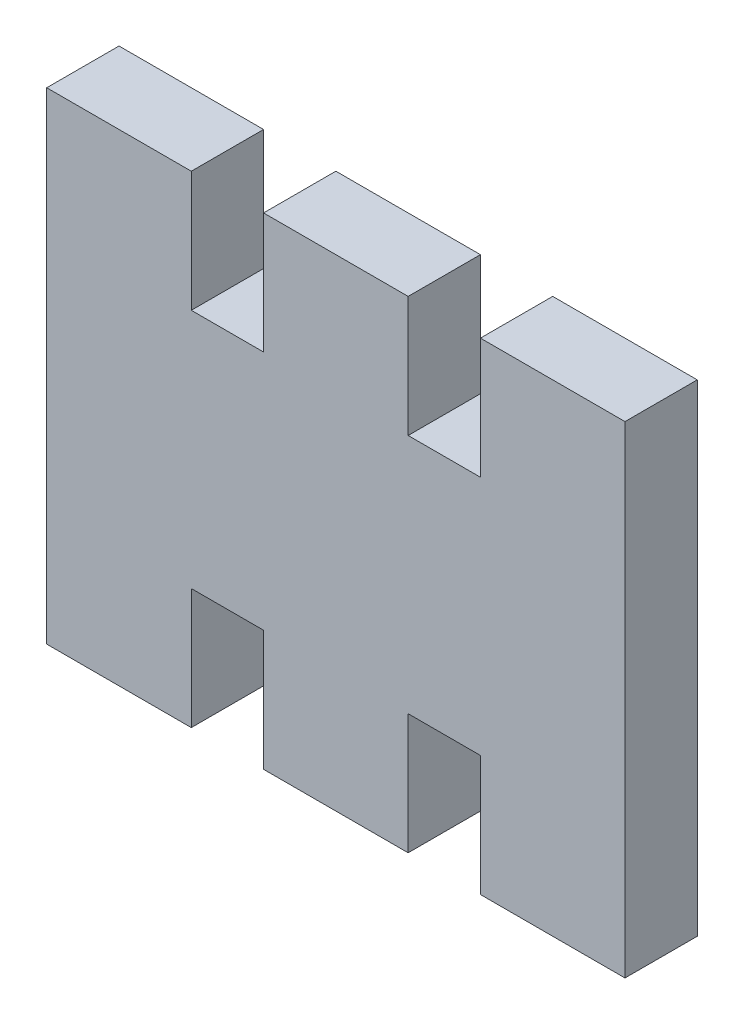
ISO-10303-21;
HEADER;
FILE_DESCRIPTION(('STEP AP214'),'2;1');
FILE_NAME('part.step','',(''),(''),'','','');
FILE_SCHEMA(('AUTOMOTIVE_DESIGN { 1 0 10303 214 1 1 1 1 }'));
ENDSEC;
DATA;
#1=APPLICATION_CONTEXT('core data for automotive mechanical design processes');
#2=APPLICATION_PROTOCOL_DEFINITION('international standard','automotive_design',2000,#1);
#3=PRODUCT_CONTEXT('',#1,'mechanical');
#4=PRODUCT('Part','Part','',(#3));
#5=PRODUCT_RELATED_PRODUCT_CATEGORY('part','',(#4));
#6=PRODUCT_DEFINITION_FORMATION('','',#4);
#7=PRODUCT_DEFINITION_CONTEXT('part definition',#1,'design');
#8=PRODUCT_DEFINITION('design','',#6,#7);
#9=PRODUCT_DEFINITION_SHAPE('','',#8);
#10=(LENGTH_UNIT() NAMED_UNIT(*) SI_UNIT(.MILLI.,.METRE.));
#11=(NAMED_UNIT(*) PLANE_ANGLE_UNIT() SI_UNIT($,.RADIAN.));
#12=(NAMED_UNIT(*) SI_UNIT($,.STERADIAN.) SOLID_ANGLE_UNIT());
#13=UNCERTAINTY_MEASURE_WITH_UNIT(LENGTH_MEASURE(1.E-05),#10,'distance_accuracy_value','');
#14=(GEOMETRIC_REPRESENTATION_CONTEXT(3) GLOBAL_UNCERTAINTY_ASSIGNED_CONTEXT((#13)) GLOBAL_UNIT_ASSIGNED_CONTEXT((#10,
#11,#12)) REPRESENTATION_CONTEXT('',''));
#15=CARTESIAN_POINT('',(0.,0.,0.));
#16=DIRECTION('',(0.,0.,1.));
#17=DIRECTION('',(1.,0.,0.));
#18=AXIS2_PLACEMENT_3D('',#15,#16,#17);
#19=CARTESIAN_POINT('',(0.,40.,6.));
#20=DIRECTION('',(0.,-1.,0.));
#21=DIRECTION('',(1.,0.,0.));
#22=AXIS2_PLACEMENT_3D('',#19,#20,#21);
#23=PLANE('',#22);
#24=DIRECTION('',(-1.,0.,0.));
#25=VECTOR('',#24,1.);
#26=CARTESIAN_POINT('',(0.,40.,6.));
#27=LINE('',#26,#25);
#28=CARTESIAN_POINT('',(-18.,40.,6.));
#29=VERTEX_POINT('',#28);
#30=CARTESIAN_POINT('',(-30.,40.,6.));
#31=VERTEX_POINT('',#30);
#32=EDGE_CURVE('E257',#29,#31,#27,.T.);
#33=ORIENTED_EDGE('',*,*,#32,.F.);
#34=DIRECTION('',(0.,0.,1.));
#35=VECTOR('',#34,1.);
#36=CARTESIAN_POINT('',(-18.,40.,0.));
#37=LINE('',#36,#35);
#38=CARTESIAN_POINT('',(-18.,40.,0.));
#39=VERTEX_POINT('',#38);
#40=EDGE_CURVE('E343',#39,#29,#37,.T.);
#41=ORIENTED_EDGE('',*,*,#40,.F.);
#42=DIRECTION('',(-1.,0.,0.));
#43=VECTOR('',#42,1.);
#44=CARTESIAN_POINT('',(0.,40.,0.));
#45=LINE('',#44,#43);
#46=CARTESIAN_POINT('',(-30.,40.,0.));
#47=VERTEX_POINT('',#46);
#48=EDGE_CURVE('E236',#39,#47,#45,.T.);
#49=ORIENTED_EDGE('',*,*,#48,.T.);
#50=DIRECTION('',(0.,0.,1.));
#51=VECTOR('',#50,1.);
#52=CARTESIAN_POINT('',(-30.,40.,0.));
#53=LINE('',#52,#51);
#54=EDGE_CURVE('E266',#47,#31,#53,.T.);
#55=ORIENTED_EDGE('',*,*,#54,.T.);
#56=EDGE_LOOP('',(#33,#41,#49,#55));
#57=FACE_BOUND('',#56,.T.);
#58=ADVANCED_FACE('F45',(#57),#23,.F.);
#59=CARTESIAN_POINT('',(0.,0.,6.));
#60=DIRECTION('',(0.,1.,0.));
#61=DIRECTION('',(-1.,0.,0.));
#62=AXIS2_PLACEMENT_3D('',#59,#60,#61);
#63=PLANE('',#62);
#64=DIRECTION('',(1.,0.,0.));
#65=VECTOR('',#64,1.);
#66=CARTESIAN_POINT('',(0.,0.,0.));
#67=LINE('',#66,#65);
#68=CARTESIAN_POINT('',(-48.,0.,0.));
#69=VERTEX_POINT('',#68);
#70=CARTESIAN_POINT('',(-36.,0.,0.));
#71=VERTEX_POINT('',#70);
#72=EDGE_CURVE('E200',#69,#71,#67,.T.);
#73=ORIENTED_EDGE('',*,*,#72,.T.);
#74=DIRECTION('',(0.,0.,1.));
#75=VECTOR('',#74,1.);
#76=CARTESIAN_POINT('',(-36.,0.,0.));
#77=LINE('',#76,#75);
#78=CARTESIAN_POINT('',(-36.,0.,6.));
#79=VERTEX_POINT('',#78);
#80=EDGE_CURVE('E183',#71,#79,#77,.T.);
#81=ORIENTED_EDGE('',*,*,#80,.T.);
#82=DIRECTION('',(1.,0.,0.));
#83=VECTOR('',#82,1.);
#84=CARTESIAN_POINT('',(0.,0.,6.));
#85=LINE('',#84,#83);
#86=CARTESIAN_POINT('',(-48.,0.,6.));
#87=VERTEX_POINT('',#86);
#88=EDGE_CURVE('E245',#87,#79,#85,.T.);
#89=ORIENTED_EDGE('',*,*,#88,.F.);
#90=DIRECTION('',(0.,0.,-1.));
#91=VECTOR('',#90,1.);
#92=CARTESIAN_POINT('',(-48.,0.,6.));
#93=LINE('',#92,#91);
#94=EDGE_CURVE('E209',#87,#69,#93,.T.);
#95=ORIENTED_EDGE('',*,*,#94,.T.);
#96=EDGE_LOOP('',(#73,#81,#89,#95));
#97=FACE_BOUND('',#96,.T.);
#98=ADVANCED_FACE('F207',(#97),#63,.F.);
#99=CARTESIAN_POINT('',(-30.,0.,6.));
#100=VERTEX_POINT('',#99);
#101=CARTESIAN_POINT('',(-18.,0.,6.));
#102=VERTEX_POINT('',#101);
#103=EDGE_CURVE('E249',#100,#102,#85,.T.);
#104=ORIENTED_EDGE('',*,*,#103,.F.);
#105=DIRECTION('',(0.,0.,1.));
#106=VECTOR('',#105,1.);
#107=CARTESIAN_POINT('',(-30.,0.,0.));
#108=LINE('',#107,#106);
#109=CARTESIAN_POINT('',(-30.,0.,0.));
#110=VERTEX_POINT('',#109);
#111=EDGE_CURVE('E194',#110,#100,#108,.T.);
#112=ORIENTED_EDGE('',*,*,#111,.F.);
#113=CARTESIAN_POINT('',(-18.,0.,0.));
#114=VERTEX_POINT('',#113);
#115=EDGE_CURVE('E212',#110,#114,#67,.T.);
#116=ORIENTED_EDGE('',*,*,#115,.T.);
#117=DIRECTION('',(0.,0.,1.));
#118=VECTOR('',#117,1.);
#119=CARTESIAN_POINT('',(-18.,0.,0.));
#120=LINE('',#119,#118);
#121=EDGE_CURVE('E296',#114,#102,#120,.T.);
#122=ORIENTED_EDGE('',*,*,#121,.T.);
#123=EDGE_LOOP('',(#104,#112,#116,#122));
#124=FACE_BOUND('',#123,.T.);
#125=ADVANCED_FACE('F392',(#124),#63,.F.);
#126=CARTESIAN_POINT('',(-36.,40.,6.));
#127=VERTEX_POINT('',#126);
#128=CARTESIAN_POINT('',(-48.,40.,6.));
#129=VERTEX_POINT('',#128);
#130=EDGE_CURVE('E218',#127,#129,#27,.T.);
#131=ORIENTED_EDGE('',*,*,#130,.F.);
#132=DIRECTION('',(0.,0.,1.));
#133=VECTOR('',#132,1.);
#134=CARTESIAN_POINT('',(-36.,40.,0.));
#135=LINE('',#134,#133);
#136=CARTESIAN_POINT('',(-36.,40.,0.));
#137=VERTEX_POINT('',#136);
#138=EDGE_CURVE('E244',#137,#127,#135,.T.);
#139=ORIENTED_EDGE('',*,*,#138,.F.);
#140=CARTESIAN_POINT('',(-48.,40.,0.));
#141=VERTEX_POINT('',#140);
#142=EDGE_CURVE('E238',#137,#141,#45,.T.);
#143=ORIENTED_EDGE('',*,*,#142,.T.);
#144=DIRECTION('',(0.,0.,-1.));
#145=VECTOR('',#144,1.);
#146=CARTESIAN_POINT('',(-48.,40.,6.));
#147=LINE('',#146,#145);
#148=EDGE_CURVE('E54',#129,#141,#147,.T.);
#149=ORIENTED_EDGE('',*,*,#148,.F.);
#150=EDGE_LOOP('',(#131,#139,#143,#149));
#151=FACE_BOUND('',#150,.T.);
#152=ADVANCED_FACE('F434',(#151),#23,.F.);
#153=CARTESIAN_POINT('',(0.,0.,6.));
#154=DIRECTION('',(-1.,0.,0.));
#155=DIRECTION('',(0.,0.,1.));
#156=AXIS2_PLACEMENT_3D('',#153,#154,#155);
#157=PLANE('',#156);
#158=DIRECTION('',(0.,1.,0.));
#159=VECTOR('',#158,1.);
#160=CARTESIAN_POINT('',(0.,0.,0.));
#161=LINE('',#160,#159);
#162=CARTESIAN_POINT('',(0.,0.,0.));
#163=VERTEX_POINT('',#162);
#164=CARTESIAN_POINT('',(0.,40.,0.));
#165=VERTEX_POINT('',#164);
#166=EDGE_CURVE('E240',#163,#165,#161,.T.);
#167=ORIENTED_EDGE('',*,*,#166,.T.);
#168=DIRECTION('',(0.,0.,-1.));
#169=VECTOR('',#168,1.);
#170=CARTESIAN_POINT('',(0.,40.,6.));
#171=LINE('',#170,#169);
#172=CARTESIAN_POINT('',(0.,40.,6.));
#173=VERTEX_POINT('',#172);
#174=EDGE_CURVE('E11',#173,#165,#171,.T.);
#175=ORIENTED_EDGE('',*,*,#174,.F.);
#176=DIRECTION('',(0.,1.,0.));
#177=VECTOR('',#176,1.);
#178=CARTESIAN_POINT('',(0.,0.,6.));
#179=LINE('',#178,#177);
#180=CARTESIAN_POINT('',(0.,0.,6.));
#181=VERTEX_POINT('',#180);
#182=EDGE_CURVE('E211',#181,#173,#179,.T.);
#183=ORIENTED_EDGE('',*,*,#182,.F.);
#184=DIRECTION('',(0.,0.,-1.));
#185=VECTOR('',#184,1.);
#186=CARTESIAN_POINT('',(0.,0.,6.));
#187=LINE('',#186,#185);
#188=EDGE_CURVE('E248',#181,#163,#187,.T.);
#189=ORIENTED_EDGE('',*,*,#188,.T.);
#190=EDGE_LOOP('',(#167,#175,#183,#189));
#191=FACE_BOUND('',#190,.T.);
#192=ADVANCED_FACE('F47',(#191),#157,.F.);
#193=CARTESIAN_POINT('',(-12.,40.,0.));
#194=VERTEX_POINT('',#193);
#195=EDGE_CURVE('E231',#165,#194,#45,.T.);
#196=ORIENTED_EDGE('',*,*,#195,.T.);
#197=DIRECTION('',(0.,0.,1.));
#198=VECTOR('',#197,1.);
#199=CARTESIAN_POINT('',(-12.,40.,0.));
#200=LINE('',#199,#198);
#201=CARTESIAN_POINT('',(-12.,40.,6.));
#202=VERTEX_POINT('',#201);
#203=EDGE_CURVE('E339',#194,#202,#200,.T.);
#204=ORIENTED_EDGE('',*,*,#203,.T.);
#205=EDGE_CURVE('E254',#173,#202,#27,.T.);
#206=ORIENTED_EDGE('',*,*,#205,.F.);
#207=ORIENTED_EDGE('',*,*,#174,.T.);
#208=EDGE_LOOP('',(#196,#204,#206,#207));
#209=FACE_BOUND('',#208,.T.);
#210=ADVANCED_FACE('F409',(#209),#23,.F.);
#211=CARTESIAN_POINT('',(-48.,0.,6.));
#212=DIRECTION('',(1.,0.,0.));
#213=DIRECTION('',(0.,0.,-1.));
#214=AXIS2_PLACEMENT_3D('',#211,#212,#213);
#215=PLANE('',#214);
#216=DIRECTION('',(0.,-1.,0.));
#217=VECTOR('',#216,1.);
#218=CARTESIAN_POINT('',(-48.,0.,0.));
#219=LINE('',#218,#217);
#220=EDGE_CURVE('E224',#141,#69,#219,.T.);
#221=ORIENTED_EDGE('',*,*,#220,.T.);
#222=ORIENTED_EDGE('',*,*,#94,.F.);
#223=DIRECTION('',(0.,-1.,0.));
#224=VECTOR('',#223,1.);
#225=CARTESIAN_POINT('',(-48.,0.,6.));
#226=LINE('',#225,#224);
#227=EDGE_CURVE('E251',#129,#87,#226,.T.);
#228=ORIENTED_EDGE('',*,*,#227,.F.);
#229=ORIENTED_EDGE('',*,*,#148,.T.);
#230=EDGE_LOOP('',(#221,#222,#228,#229));
#231=FACE_BOUND('',#230,.T.);
#232=ADVANCED_FACE('F437',(#231),#215,.F.);
#233=CARTESIAN_POINT('',(-12.,0.,6.));
#234=VERTEX_POINT('',#233);
#235=EDGE_CURVE('E250',#234,#181,#85,.T.);
#236=ORIENTED_EDGE('',*,*,#235,.F.);
#237=DIRECTION('',(0.,0.,1.));
#238=VECTOR('',#237,1.);
#239=CARTESIAN_POINT('',(-12.,0.,0.));
#240=LINE('',#239,#238);
#241=CARTESIAN_POINT('',(-12.,0.,0.));
#242=VERTEX_POINT('',#241);
#243=EDGE_CURVE('E300',#242,#234,#240,.T.);
#244=ORIENTED_EDGE('',*,*,#243,.F.);
#245=EDGE_CURVE('E214',#242,#163,#67,.T.);
#246=ORIENTED_EDGE('',*,*,#245,.T.);
#247=ORIENTED_EDGE('',*,*,#188,.F.);
#248=EDGE_LOOP('',(#236,#244,#246,#247));
#249=FACE_BOUND('',#248,.T.);
#250=ADVANCED_FACE('F404',(#249),#63,.F.);
#251=CARTESIAN_POINT('',(0.,0.,6.));
#252=DIRECTION('',(0.,0.,1.));
#253=DIRECTION('',(1.,0.,0.));
#254=AXIS2_PLACEMENT_3D('',#251,#252,#253);
#255=PLANE('',#254);
#256=DIRECTION('',(0.,-1.,0.));
#257=VECTOR('',#256,1.);
#258=CARTESIAN_POINT('',(-36.,10.,6.));
#259=LINE('',#258,#257);
#260=CARTESIAN_POINT('',(-36.,10.,6.));
#261=VERTEX_POINT('',#260);
#262=EDGE_CURVE('E188',#261,#79,#259,.T.);
#263=ORIENTED_EDGE('',*,*,#262,.F.);
#264=DIRECTION('',(-1.,0.,0.));
#265=VECTOR('',#264,1.);
#266=CARTESIAN_POINT('',(-36.,10.,6.));
#267=LINE('',#266,#265);
#268=CARTESIAN_POINT('',(-30.,10.,6.));
#269=VERTEX_POINT('',#268);
#270=EDGE_CURVE('E204',#269,#261,#267,.T.);
#271=ORIENTED_EDGE('',*,*,#270,.F.);
#272=DIRECTION('',(0.,1.,0.));
#273=VECTOR('',#272,1.);
#274=CARTESIAN_POINT('',(-30.,10.,6.));
#275=LINE('',#274,#273);
#276=EDGE_CURVE('E376',#100,#269,#275,.T.);
#277=ORIENTED_EDGE('',*,*,#276,.F.);
#278=ORIENTED_EDGE('',*,*,#103,.T.);
#279=DIRECTION('',(0.,-1.,0.));
#280=VECTOR('',#279,1.);
#281=CARTESIAN_POINT('',(-18.,10.,6.));
#282=LINE('',#281,#280);
#283=CARTESIAN_POINT('',(-18.,10.,6.));
#284=VERTEX_POINT('',#283);
#285=EDGE_CURVE('E320',#284,#102,#282,.T.);
#286=ORIENTED_EDGE('',*,*,#285,.F.);
#287=DIRECTION('',(-1.,0.,0.));
#288=VECTOR('',#287,1.);
#289=CARTESIAN_POINT('',(-18.,10.,6.));
#290=LINE('',#289,#288);
#291=CARTESIAN_POINT('',(-12.,10.,6.));
#292=VERTEX_POINT('',#291);
#293=EDGE_CURVE('E311',#292,#284,#290,.T.);
#294=ORIENTED_EDGE('',*,*,#293,.F.);
#295=DIRECTION('',(0.,1.,0.));
#296=VECTOR('',#295,1.);
#297=CARTESIAN_POINT('',(-12.,10.,6.));
#298=LINE('',#297,#296);
#299=EDGE_CURVE('E316',#234,#292,#298,.T.);
#300=ORIENTED_EDGE('',*,*,#299,.F.);
#301=ORIENTED_EDGE('',*,*,#235,.T.);
#302=ORIENTED_EDGE('',*,*,#182,.T.);
#303=ORIENTED_EDGE('',*,*,#205,.T.);
#304=DIRECTION('',(0.,1.,0.));
#305=VECTOR('',#304,1.);
#306=CARTESIAN_POINT('',(-12.,40.,6.));
#307=LINE('',#306,#305);
#308=CARTESIAN_POINT('',(-12.,30.,6.));
#309=VERTEX_POINT('',#308);
#310=EDGE_CURVE('E346',#309,#202,#307,.T.);
#311=ORIENTED_EDGE('',*,*,#310,.F.);
#312=DIRECTION('',(1.,0.,0.));
#313=VECTOR('',#312,1.);
#314=CARTESIAN_POINT('',(-18.,30.,6.));
#315=LINE('',#314,#313);
#316=CARTESIAN_POINT('',(-18.,30.,6.));
#317=VERTEX_POINT('',#316);
#318=EDGE_CURVE('E350',#317,#309,#315,.T.);
#319=ORIENTED_EDGE('',*,*,#318,.F.);
#320=DIRECTION('',(0.,-1.,0.));
#321=VECTOR('',#320,1.);
#322=CARTESIAN_POINT('',(-18.,40.,6.));
#323=LINE('',#322,#321);
#324=EDGE_CURVE('E310',#29,#317,#323,.T.);
#325=ORIENTED_EDGE('',*,*,#324,.F.);
#326=ORIENTED_EDGE('',*,*,#32,.T.);
#327=DIRECTION('',(0.,1.,0.));
#328=VECTOR('',#327,1.);
#329=CARTESIAN_POINT('',(-30.,40.,6.));
#330=LINE('',#329,#328);
#331=CARTESIAN_POINT('',(-30.,30.,6.));
#332=VERTEX_POINT('',#331);
#333=EDGE_CURVE('E272',#332,#31,#330,.T.);
#334=ORIENTED_EDGE('',*,*,#333,.F.);
#335=DIRECTION('',(1.,0.,0.));
#336=VECTOR('',#335,1.);
#337=CARTESIAN_POINT('',(-36.,30.,6.));
#338=LINE('',#337,#336);
#339=CARTESIAN_POINT('',(-36.,30.,6.));
#340=VERTEX_POINT('',#339);
#341=EDGE_CURVE('E277',#340,#332,#338,.T.);
#342=ORIENTED_EDGE('',*,*,#341,.F.);
#343=DIRECTION('',(0.,-1.,0.));
#344=VECTOR('',#343,1.);
#345=CARTESIAN_POINT('',(-36.,40.,6.));
#346=LINE('',#345,#344);
#347=EDGE_CURVE('E281',#127,#340,#346,.T.);
#348=ORIENTED_EDGE('',*,*,#347,.F.);
#349=ORIENTED_EDGE('',*,*,#130,.T.);
#350=ORIENTED_EDGE('',*,*,#227,.T.);
#351=ORIENTED_EDGE('',*,*,#88,.T.);
#352=EDGE_LOOP('',(#263,#271,#277,#278,#286,#294,#300,#301,#302,#303,#311,#319,#325,#326,#334,
#342,#348,#349,#350,#351));
#353=FACE_BOUND('',#352,.T.);
#354=ADVANCED_FACE('F400',(#353),#255,.T.);
#355=CARTESIAN_POINT('',(0.,0.,0.));
#356=DIRECTION('',(0.,0.,1.));
#357=DIRECTION('',(1.,0.,0.));
#358=AXIS2_PLACEMENT_3D('',#355,#356,#357);
#359=PLANE('',#358);
#360=DIRECTION('',(-1.,0.,0.));
#361=VECTOR('',#360,1.);
#362=CARTESIAN_POINT('',(-36.,10.,0.));
#363=LINE('',#362,#361);
#364=CARTESIAN_POINT('',(-30.,10.,0.));
#365=VERTEX_POINT('',#364);
#366=CARTESIAN_POINT('',(-36.,10.,0.));
#367=VERTEX_POINT('',#366);
#368=EDGE_CURVE('E61',#365,#367,#363,.T.);
#369=ORIENTED_EDGE('',*,*,#368,.T.);
#370=DIRECTION('',(0.,-1.,0.));
#371=VECTOR('',#370,1.);
#372=CARTESIAN_POINT('',(-36.,10.,0.));
#373=LINE('',#372,#371);
#374=EDGE_CURVE('E186',#367,#71,#373,.T.);
#375=ORIENTED_EDGE('',*,*,#374,.T.);
#376=ORIENTED_EDGE('',*,*,#72,.F.);
#377=ORIENTED_EDGE('',*,*,#220,.F.);
#378=ORIENTED_EDGE('',*,*,#142,.F.);
#379=DIRECTION('',(0.,-1.,0.));
#380=VECTOR('',#379,1.);
#381=CARTESIAN_POINT('',(-36.,40.,0.));
#382=LINE('',#381,#380);
#383=CARTESIAN_POINT('',(-36.,30.,0.));
#384=VERTEX_POINT('',#383);
#385=EDGE_CURVE('E276',#137,#384,#382,.T.);
#386=ORIENTED_EDGE('',*,*,#385,.T.);
#387=DIRECTION('',(1.,0.,0.));
#388=VECTOR('',#387,1.);
#389=CARTESIAN_POINT('',(-36.,30.,0.));
#390=LINE('',#389,#388);
#391=CARTESIAN_POINT('',(-30.,30.,0.));
#392=VERTEX_POINT('',#391);
#393=EDGE_CURVE('E289',#384,#392,#390,.T.);
#394=ORIENTED_EDGE('',*,*,#393,.T.);
#395=DIRECTION('',(0.,1.,0.));
#396=VECTOR('',#395,1.);
#397=CARTESIAN_POINT('',(-30.,40.,0.));
#398=LINE('',#397,#396);
#399=EDGE_CURVE('E263',#392,#47,#398,.T.);
#400=ORIENTED_EDGE('',*,*,#399,.T.);
#401=ORIENTED_EDGE('',*,*,#48,.F.);
#402=DIRECTION('',(0.,-1.,0.));
#403=VECTOR('',#402,1.);
#404=CARTESIAN_POINT('',(-18.,40.,0.));
#405=LINE('',#404,#403);
#406=CARTESIAN_POINT('',(-18.,30.,0.));
#407=VERTEX_POINT('',#406);
#408=EDGE_CURVE('E349',#39,#407,#405,.T.);
#409=ORIENTED_EDGE('',*,*,#408,.T.);
#410=DIRECTION('',(1.,0.,0.));
#411=VECTOR('',#410,1.);
#412=CARTESIAN_POINT('',(-18.,30.,0.));
#413=LINE('',#412,#411);
#414=CARTESIAN_POINT('',(-12.,30.,0.));
#415=VERTEX_POINT('',#414);
#416=EDGE_CURVE('E359',#407,#415,#413,.T.);
#417=ORIENTED_EDGE('',*,*,#416,.T.);
#418=DIRECTION('',(0.,1.,0.));
#419=VECTOR('',#418,1.);
#420=CARTESIAN_POINT('',(-12.,40.,0.));
#421=LINE('',#420,#419);
#422=EDGE_CURVE('E69',#415,#194,#421,.T.);
#423=ORIENTED_EDGE('',*,*,#422,.T.);
#424=ORIENTED_EDGE('',*,*,#195,.F.);
#425=ORIENTED_EDGE('',*,*,#166,.F.);
#426=ORIENTED_EDGE('',*,*,#245,.F.);
#427=DIRECTION('',(0.,1.,0.));
#428=VECTOR('',#427,1.);
#429=CARTESIAN_POINT('',(-12.,10.,0.));
#430=LINE('',#429,#428);
#431=CARTESIAN_POINT('',(-12.,10.,0.));
#432=VERTEX_POINT('',#431);
#433=EDGE_CURVE('E326',#242,#432,#430,.T.);
#434=ORIENTED_EDGE('',*,*,#433,.T.);
#435=DIRECTION('',(-1.,0.,0.));
#436=VECTOR('',#435,1.);
#437=CARTESIAN_POINT('',(-18.,10.,0.));
#438=LINE('',#437,#436);
#439=CARTESIAN_POINT('',(-18.,10.,0.));
#440=VERTEX_POINT('',#439);
#441=EDGE_CURVE('E301',#432,#440,#438,.T.);
#442=ORIENTED_EDGE('',*,*,#441,.T.);
#443=DIRECTION('',(0.,-1.,0.));
#444=VECTOR('',#443,1.);
#445=CARTESIAN_POINT('',(-18.,10.,0.));
#446=LINE('',#445,#444);
#447=EDGE_CURVE('E315',#440,#114,#446,.T.);
#448=ORIENTED_EDGE('',*,*,#447,.T.);
#449=ORIENTED_EDGE('',*,*,#115,.F.);
#450=DIRECTION('',(0.,1.,0.));
#451=VECTOR('',#450,1.);
#452=CARTESIAN_POINT('',(-30.,10.,0.));
#453=LINE('',#452,#451);
#454=EDGE_CURVE('E203',#110,#365,#453,.T.);
#455=ORIENTED_EDGE('',*,*,#454,.T.);
#456=EDGE_LOOP('',(#369,#375,#376,#377,#378,#386,#394,#400,#401,#409,#417,#423,#424,#425,#426,
#434,#442,#448,#449,#455));
#457=FACE_BOUND('',#456,.T.);
#458=ADVANCED_FACE('F198',(#457),#359,.F.);
#459=CARTESIAN_POINT('',(-36.,40.,0.));
#460=DIRECTION('',(-1.,0.,0.));
#461=DIRECTION('',(0.,0.,1.));
#462=AXIS2_PLACEMENT_3D('',#459,#460,#461);
#463=PLANE('',#462);
#464=ORIENTED_EDGE('',*,*,#347,.T.);
#465=DIRECTION('',(0.,0.,1.));
#466=VECTOR('',#465,1.);
#467=CARTESIAN_POINT('',(-36.,30.,0.));
#468=LINE('',#467,#466);
#469=EDGE_CURVE('E259',#384,#340,#468,.T.);
#470=ORIENTED_EDGE('',*,*,#469,.F.);
#471=ORIENTED_EDGE('',*,*,#385,.F.);
#472=ORIENTED_EDGE('',*,*,#138,.T.);
#473=EDGE_LOOP('',(#464,#470,#471,#472));
#474=FACE_BOUND('',#473,.T.);
#475=ADVANCED_FACE('F508',(#474),#463,.F.);
#476=CARTESIAN_POINT('',(-30.,40.,0.));
#477=DIRECTION('',(1.,0.,0.));
#478=DIRECTION('',(0.,0.,-1.));
#479=AXIS2_PLACEMENT_3D('',#476,#477,#478);
#480=PLANE('',#479);
#481=ORIENTED_EDGE('',*,*,#333,.T.);
#482=ORIENTED_EDGE('',*,*,#54,.F.);
#483=ORIENTED_EDGE('',*,*,#399,.F.);
#484=DIRECTION('',(0.,0.,1.));
#485=VECTOR('',#484,1.);
#486=CARTESIAN_POINT('',(-30.,30.,0.));
#487=LINE('',#486,#485);
#488=EDGE_CURVE('E262',#392,#332,#487,.T.);
#489=ORIENTED_EDGE('',*,*,#488,.T.);
#490=EDGE_LOOP('',(#481,#482,#483,#489));
#491=FACE_BOUND('',#490,.T.);
#492=ADVANCED_FACE('F497',(#491),#480,.F.);
#493=CARTESIAN_POINT('',(-36.,30.,0.));
#494=DIRECTION('',(0.,-1.,0.));
#495=DIRECTION('',(0.,0.,-1.));
#496=AXIS2_PLACEMENT_3D('',#493,#494,#495);
#497=PLANE('',#496);
#498=ORIENTED_EDGE('',*,*,#341,.T.);
#499=ORIENTED_EDGE('',*,*,#488,.F.);
#500=ORIENTED_EDGE('',*,*,#393,.F.);
#501=ORIENTED_EDGE('',*,*,#469,.T.);
#502=EDGE_LOOP('',(#498,#499,#500,#501));
#503=FACE_BOUND('',#502,.T.);
#504=ADVANCED_FACE('F491',(#503),#497,.F.);
#505=CARTESIAN_POINT('',(-18.,10.,0.));
#506=DIRECTION('',(-1.,0.,0.));
#507=DIRECTION('',(0.,0.,1.));
#508=AXIS2_PLACEMENT_3D('',#505,#506,#507);
#509=PLANE('',#508);
#510=ORIENTED_EDGE('',*,*,#285,.T.);
#511=ORIENTED_EDGE('',*,*,#121,.F.);
#512=ORIENTED_EDGE('',*,*,#447,.F.);
#513=DIRECTION('',(0.,0.,1.));
#514=VECTOR('',#513,1.);
#515=CARTESIAN_POINT('',(-18.,10.,0.));
#516=LINE('',#515,#514);
#517=EDGE_CURVE('E307',#440,#284,#516,.T.);
#518=ORIENTED_EDGE('',*,*,#517,.T.);
#519=EDGE_LOOP('',(#510,#511,#512,#518));
#520=FACE_BOUND('',#519,.T.);
#521=ADVANCED_FACE('F496',(#520),#509,.F.);
#522=CARTESIAN_POINT('',(-18.,10.,0.));
#523=DIRECTION('',(0.,1.,0.));
#524=DIRECTION('',(0.,0.,1.));
#525=AXIS2_PLACEMENT_3D('',#522,#523,#524);
#526=PLANE('',#525);
#527=ORIENTED_EDGE('',*,*,#293,.T.);
#528=ORIENTED_EDGE('',*,*,#517,.F.);
#529=ORIENTED_EDGE('',*,*,#441,.F.);
#530=DIRECTION('',(0.,0.,1.));
#531=VECTOR('',#530,1.);
#532=CARTESIAN_POINT('',(-12.,10.,0.));
#533=LINE('',#532,#531);
#534=EDGE_CURVE('E304',#432,#292,#533,.T.);
#535=ORIENTED_EDGE('',*,*,#534,.T.);
#536=EDGE_LOOP('',(#527,#528,#529,#535));
#537=FACE_BOUND('',#536,.T.);
#538=ADVANCED_FACE('F585',(#537),#526,.F.);
#539=CARTESIAN_POINT('',(-12.,10.,0.));
#540=DIRECTION('',(1.,0.,0.));
#541=DIRECTION('',(0.,0.,-1.));
#542=AXIS2_PLACEMENT_3D('',#539,#540,#541);
#543=PLANE('',#542);
#544=ORIENTED_EDGE('',*,*,#299,.T.);
#545=ORIENTED_EDGE('',*,*,#534,.F.);
#546=ORIENTED_EDGE('',*,*,#433,.F.);
#547=ORIENTED_EDGE('',*,*,#243,.T.);
#548=EDGE_LOOP('',(#544,#545,#546,#547));
#549=FACE_BOUND('',#548,.T.);
#550=ADVANCED_FACE('F587',(#549),#543,.F.);
#551=CARTESIAN_POINT('',(-18.,40.,0.));
#552=DIRECTION('',(-1.,0.,0.));
#553=DIRECTION('',(0.,0.,1.));
#554=AXIS2_PLACEMENT_3D('',#551,#552,#553);
#555=PLANE('',#554);
#556=ORIENTED_EDGE('',*,*,#324,.T.);
#557=DIRECTION('',(0.,0.,1.));
#558=VECTOR('',#557,1.);
#559=CARTESIAN_POINT('',(-18.,30.,0.));
#560=LINE('',#559,#558);
#561=EDGE_CURVE('E333',#407,#317,#560,.T.);
#562=ORIENTED_EDGE('',*,*,#561,.F.);
#563=ORIENTED_EDGE('',*,*,#408,.F.);
#564=ORIENTED_EDGE('',*,*,#40,.T.);
#565=EDGE_LOOP('',(#556,#562,#563,#564));
#566=FACE_BOUND('',#565,.T.);
#567=ADVANCED_FACE('F418',(#566),#555,.F.);
#568=CARTESIAN_POINT('',(-12.,40.,0.));
#569=DIRECTION('',(1.,0.,0.));
#570=DIRECTION('',(0.,0.,-1.));
#571=AXIS2_PLACEMENT_3D('',#568,#569,#570);
#572=PLANE('',#571);
#573=ORIENTED_EDGE('',*,*,#310,.T.);
#574=ORIENTED_EDGE('',*,*,#203,.F.);
#575=ORIENTED_EDGE('',*,*,#422,.F.);
#576=DIRECTION('',(0.,0.,1.));
#577=VECTOR('',#576,1.);
#578=CARTESIAN_POINT('',(-12.,30.,0.));
#579=LINE('',#578,#577);
#580=EDGE_CURVE('E336',#415,#309,#579,.T.);
#581=ORIENTED_EDGE('',*,*,#580,.T.);
#582=EDGE_LOOP('',(#573,#574,#575,#581));
#583=FACE_BOUND('',#582,.T.);
#584=ADVANCED_FACE('F413',(#583),#572,.F.);
#585=CARTESIAN_POINT('',(-18.,30.,0.));
#586=DIRECTION('',(0.,-1.,0.));
#587=DIRECTION('',(0.,0.,-1.));
#588=AXIS2_PLACEMENT_3D('',#585,#586,#587);
#589=PLANE('',#588);
#590=ORIENTED_EDGE('',*,*,#318,.T.);
#591=ORIENTED_EDGE('',*,*,#580,.F.);
#592=ORIENTED_EDGE('',*,*,#416,.F.);
#593=ORIENTED_EDGE('',*,*,#561,.T.);
#594=EDGE_LOOP('',(#590,#591,#592,#593));
#595=FACE_BOUND('',#594,.T.);
#596=ADVANCED_FACE('F416',(#595),#589,.F.);
#597=CARTESIAN_POINT('',(-36.,10.,0.));
#598=DIRECTION('',(-1.,0.,0.));
#599=DIRECTION('',(0.,0.,1.));
#600=AXIS2_PLACEMENT_3D('',#597,#598,#599);
#601=PLANE('',#600);
#602=ORIENTED_EDGE('',*,*,#262,.T.);
#603=ORIENTED_EDGE('',*,*,#80,.F.);
#604=ORIENTED_EDGE('',*,*,#374,.F.);
#605=DIRECTION('',(0.,0.,1.));
#606=VECTOR('',#605,1.);
#607=CARTESIAN_POINT('',(-36.,10.,0.));
#608=LINE('',#607,#606);
#609=EDGE_CURVE('E285',#367,#261,#608,.T.);
#610=ORIENTED_EDGE('',*,*,#609,.T.);
#611=EDGE_LOOP('',(#602,#603,#604,#610));
#612=FACE_BOUND('',#611,.T.);
#613=ADVANCED_FACE('F185',(#612),#601,.F.);
#614=CARTESIAN_POINT('',(-36.,10.,0.));
#615=DIRECTION('',(0.,1.,0.));
#616=DIRECTION('',(0.,0.,1.));
#617=AXIS2_PLACEMENT_3D('',#614,#615,#616);
#618=PLANE('',#617);
#619=ORIENTED_EDGE('',*,*,#270,.T.);
#620=ORIENTED_EDGE('',*,*,#609,.F.);
#621=ORIENTED_EDGE('',*,*,#368,.F.);
#622=DIRECTION('',(0.,0.,1.));
#623=VECTOR('',#622,1.);
#624=CARTESIAN_POINT('',(-30.,10.,0.));
#625=LINE('',#624,#623);
#626=EDGE_CURVE('E368',#365,#269,#625,.T.);
#627=ORIENTED_EDGE('',*,*,#626,.T.);
#628=EDGE_LOOP('',(#619,#620,#621,#627));
#629=FACE_BOUND('',#628,.T.);
#630=ADVANCED_FACE('F441',(#629),#618,.F.);
#631=CARTESIAN_POINT('',(-30.,10.,0.));
#632=DIRECTION('',(1.,0.,0.));
#633=DIRECTION('',(0.,0.,-1.));
#634=AXIS2_PLACEMENT_3D('',#631,#632,#633);
#635=PLANE('',#634);
#636=ORIENTED_EDGE('',*,*,#276,.T.);
#637=ORIENTED_EDGE('',*,*,#626,.F.);
#638=ORIENTED_EDGE('',*,*,#454,.F.);
#639=ORIENTED_EDGE('',*,*,#111,.T.);
#640=EDGE_LOOP('',(#636,#637,#638,#639));
#641=FACE_BOUND('',#640,.T.);
#642=ADVANCED_FACE('F388',(#641),#635,.F.);
#643=CLOSED_SHELL('',(#58,#98,#125,#152,#192,#210,#232,#250,#354,#458,#475,#492,#504,#521,#538,
#550,#567,#584,#596,#613,#630,#642));
#644=MANIFOLD_SOLID_BREP('B2',#643);
#645=ADVANCED_BREP_SHAPE_REPRESENTATION('',(#18,#644),#14);
#646=SHAPE_DEFINITION_REPRESENTATION(#9,#645);
ENDSEC;
END-ISO-10303-21;
